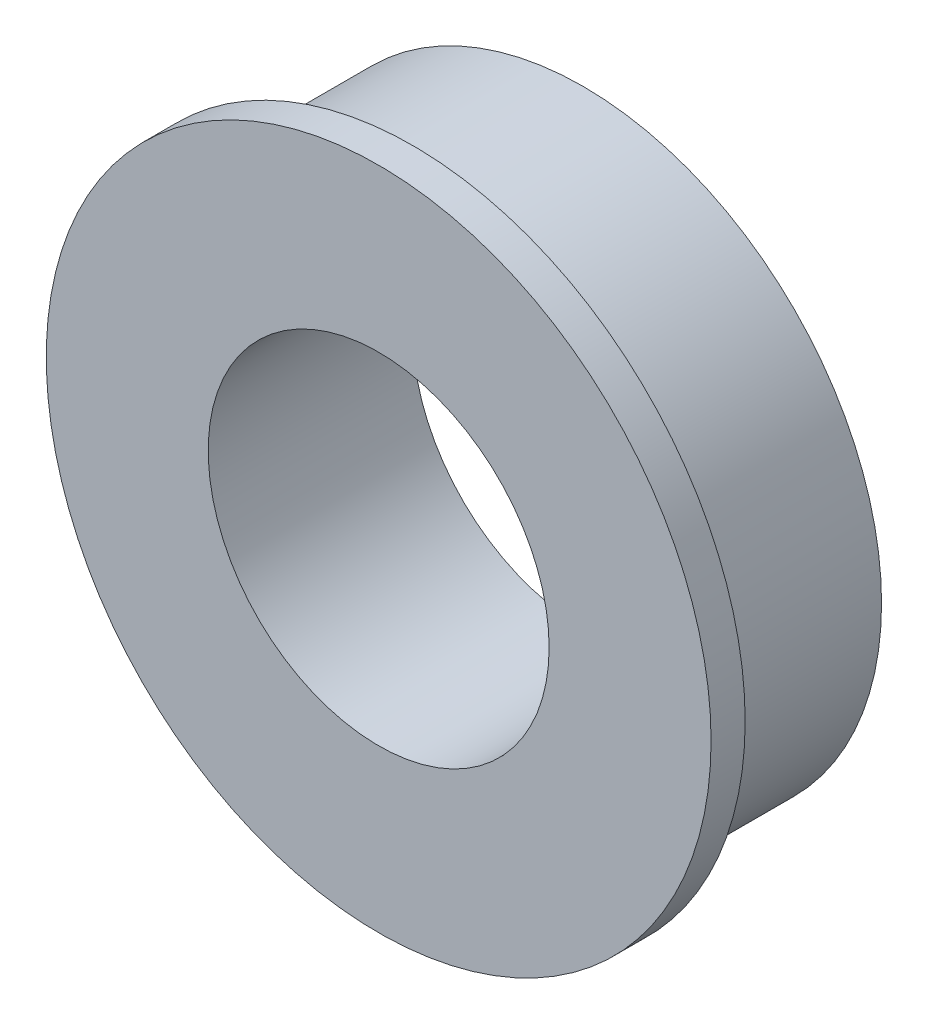
ISO-10303-21;
HEADER;
FILE_DESCRIPTION(('STEP AP214'),'2;1');
FILE_NAME('part.step','',(''),(''),'','','');
FILE_SCHEMA(('AUTOMOTIVE_DESIGN { 1 0 10303 214 1 1 1 1 }'));
ENDSEC;
DATA;
#1=APPLICATION_CONTEXT('core data for automotive mechanical design processes');
#2=APPLICATION_PROTOCOL_DEFINITION('international standard','automotive_design',2000,#1);
#3=PRODUCT_CONTEXT('',#1,'mechanical');
#4=PRODUCT('Part','Part','',(#3));
#5=PRODUCT_RELATED_PRODUCT_CATEGORY('part','',(#4));
#6=PRODUCT_DEFINITION_FORMATION('','',#4);
#7=PRODUCT_DEFINITION_CONTEXT('part definition',#1,'design');
#8=PRODUCT_DEFINITION('design','',#6,#7);
#9=PRODUCT_DEFINITION_SHAPE('','',#8);
#10=(LENGTH_UNIT() NAMED_UNIT(*) SI_UNIT(.MILLI.,.METRE.));
#11=(NAMED_UNIT(*) PLANE_ANGLE_UNIT() SI_UNIT($,.RADIAN.));
#12=(NAMED_UNIT(*) SI_UNIT($,.STERADIAN.) SOLID_ANGLE_UNIT());
#13=UNCERTAINTY_MEASURE_WITH_UNIT(LENGTH_MEASURE(1.E-05),#10,'distance_accuracy_value','');
#14=(GEOMETRIC_REPRESENTATION_CONTEXT(3) GLOBAL_UNCERTAINTY_ASSIGNED_CONTEXT((#13)) GLOBAL_UNIT_ASSIGNED_CONTEXT((#10,
#11,#12)) REPRESENTATION_CONTEXT('',''));
#15=CARTESIAN_POINT('',(0.,0.,0.));
#16=DIRECTION('',(0.,0.,1.));
#17=DIRECTION('',(1.,0.,0.));
#18=AXIS2_PLACEMENT_3D('',#15,#16,#17);
#19=CARTESIAN_POINT('',(0.,0.,0.));
#20=DIRECTION('',(0.,0.,1.));
#21=DIRECTION('',(1.,0.,0.));
#22=AXIS2_PLACEMENT_3D('',#19,#20,#21);
#23=PLANE('',#22);
#24=CARTESIAN_POINT('',(0.,0.,0.));
#25=DIRECTION('',(0.,0.,1.));
#26=DIRECTION('',(1.,0.,0.));
#27=AXIS2_PLACEMENT_3D('',#24,#25,#26);
#28=CIRCLE('',#27,7.);
#29=CARTESIAN_POINT('',(7.,0.,0.));
#30=VERTEX_POINT('',#29);
#31=EDGE_CURVE('E38',#30,#30,#28,.T.);
#32=ORIENTED_EDGE('',*,*,#31,.F.);
#33=EDGE_LOOP('',(#32));
#34=FACE_BOUND('',#33,.T.);
#35=CARTESIAN_POINT('',(0.,0.,0.));
#36=DIRECTION('',(0.,0.,1.));
#37=DIRECTION('',(1.,0.,0.));
#38=AXIS2_PLACEMENT_3D('',#35,#36,#37);
#39=CIRCLE('',#38,4.);
#40=CARTESIAN_POINT('',(4.,0.,0.));
#41=VERTEX_POINT('',#40);
#42=EDGE_CURVE('E45',#41,#41,#39,.T.);
#43=ORIENTED_EDGE('',*,*,#42,.T.);
#44=EDGE_LOOP('',(#43));
#45=FACE_BOUND('',#44,.T.);
#46=ADVANCED_FACE('F34',(#34,#45),#23,.F.);
#47=CARTESIAN_POINT('',(0.,0.,4.));
#48=DIRECTION('',(0.,0.,-1.));
#49=DIRECTION('',(-1.,0.,0.));
#50=AXIS2_PLACEMENT_3D('',#47,#48,#49);
#51=CYLINDRICAL_SURFACE('',#50,7.);
#52=CARTESIAN_POINT('',(0.,0.,4.));
#53=DIRECTION('',(0.,0.,1.));
#54=DIRECTION('',(1.,0.,0.));
#55=AXIS2_PLACEMENT_3D('',#52,#53,#54);
#56=CIRCLE('',#55,7.);
#57=CARTESIAN_POINT('',(7.,0.,4.));
#58=VERTEX_POINT('',#57);
#59=EDGE_CURVE('E10',#58,#58,#56,.T.);
#60=ORIENTED_EDGE('',*,*,#59,.F.);
#61=EDGE_LOOP('',(#60));
#62=FACE_BOUND('',#61,.T.);
#63=ORIENTED_EDGE('',*,*,#31,.T.);
#64=EDGE_LOOP('',(#63));
#65=FACE_BOUND('',#64,.T.);
#66=ADVANCED_FACE('F36',(#62,#65),#51,.T.);
#67=CARTESIAN_POINT('',(0.,0.,4.));
#68=DIRECTION('',(0.,0.,-1.));
#69=DIRECTION('',(-1.,0.,0.));
#70=AXIS2_PLACEMENT_3D('',#67,#68,#69);
#71=CYLINDRICAL_SURFACE('',#70,4.);
#72=ORIENTED_EDGE('',*,*,#42,.F.);
#73=EDGE_LOOP('',(#72));
#74=FACE_BOUND('',#73,.T.);
#75=CARTESIAN_POINT('',(0.,0.,4.8));
#76=DIRECTION('',(0.,0.,1.));
#77=DIRECTION('',(1.,0.,0.));
#78=AXIS2_PLACEMENT_3D('',#75,#76,#77);
#79=CIRCLE('',#78,4.);
#80=CARTESIAN_POINT('',(4.,0.,4.8));
#81=VERTEX_POINT('',#80);
#82=EDGE_CURVE('E53',#81,#81,#79,.T.);
#83=ORIENTED_EDGE('',*,*,#82,.T.);
#84=EDGE_LOOP('',(#83));
#85=FACE_BOUND('',#84,.T.);
#86=ADVANCED_FACE('F59',(#74,#85),#71,.F.);
#87=CARTESIAN_POINT('',(0.,0.,4.8));
#88=DIRECTION('',(0.,0.,1.));
#89=DIRECTION('',(1.,0.,0.));
#90=AXIS2_PLACEMENT_3D('',#87,#88,#89);
#91=PLANE('',#90);
#92=CARTESIAN_POINT('',(0.,0.,4.8));
#93=DIRECTION('',(0.,0.,1.));
#94=DIRECTION('',(1.,0.,0.));
#95=AXIS2_PLACEMENT_3D('',#92,#93,#94);
#96=CIRCLE('',#95,7.8);
#97=CARTESIAN_POINT('',(7.8,0.,4.8));
#98=VERTEX_POINT('',#97);
#99=EDGE_CURVE('E49',#98,#98,#96,.T.);
#100=ORIENTED_EDGE('',*,*,#99,.T.);
#101=EDGE_LOOP('',(#100));
#102=FACE_BOUND('',#101,.T.);
#103=ORIENTED_EDGE('',*,*,#82,.F.);
#104=EDGE_LOOP('',(#103));
#105=FACE_BOUND('',#104,.T.);
#106=ADVANCED_FACE('F61',(#102,#105),#91,.T.);
#107=CARTESIAN_POINT('',(0.,0.,4.));
#108=DIRECTION('',(0.,0.,1.));
#109=DIRECTION('',(1.,0.,0.));
#110=AXIS2_PLACEMENT_3D('',#107,#108,#109);
#111=PLANE('',#110);
#112=ORIENTED_EDGE('',*,*,#59,.T.);
#113=EDGE_LOOP('',(#112));
#114=FACE_BOUND('',#113,.T.);
#115=CARTESIAN_POINT('',(0.,0.,4.));
#116=DIRECTION('',(0.,0.,1.));
#117=DIRECTION('',(1.,0.,0.));
#118=AXIS2_PLACEMENT_3D('',#115,#116,#117);
#119=CIRCLE('',#118,7.8);
#120=CARTESIAN_POINT('',(7.8,0.,4.));
#121=VERTEX_POINT('',#120);
#122=EDGE_CURVE('E50',#121,#121,#119,.T.);
#123=ORIENTED_EDGE('',*,*,#122,.F.);
#124=EDGE_LOOP('',(#123));
#125=FACE_BOUND('',#124,.T.);
#126=ADVANCED_FACE('F63',(#114,#125),#111,.F.);
#127=CARTESIAN_POINT('',(0.,0.,4.8));
#128=DIRECTION('',(0.,0.,-1.));
#129=DIRECTION('',(-1.,0.,0.));
#130=AXIS2_PLACEMENT_3D('',#127,#128,#129);
#131=CYLINDRICAL_SURFACE('',#130,7.8);
#132=ORIENTED_EDGE('',*,*,#99,.F.);
#133=EDGE_LOOP('',(#132));
#134=FACE_BOUND('',#133,.T.);
#135=ORIENTED_EDGE('',*,*,#122,.T.);
#136=EDGE_LOOP('',(#135));
#137=FACE_BOUND('',#136,.T.);
#138=ADVANCED_FACE('F70',(#134,#137),#131,.T.);
#139=CLOSED_SHELL('',(#46,#66,#86,#106,#126,#138));
#140=MANIFOLD_SOLID_BREP('B2',#139);
#141=ADVANCED_BREP_SHAPE_REPRESENTATION('',(#18,#140),#14);
#142=SHAPE_DEFINITION_REPRESENTATION(#9,#141);
ENDSEC;
END-ISO-10303-21;
